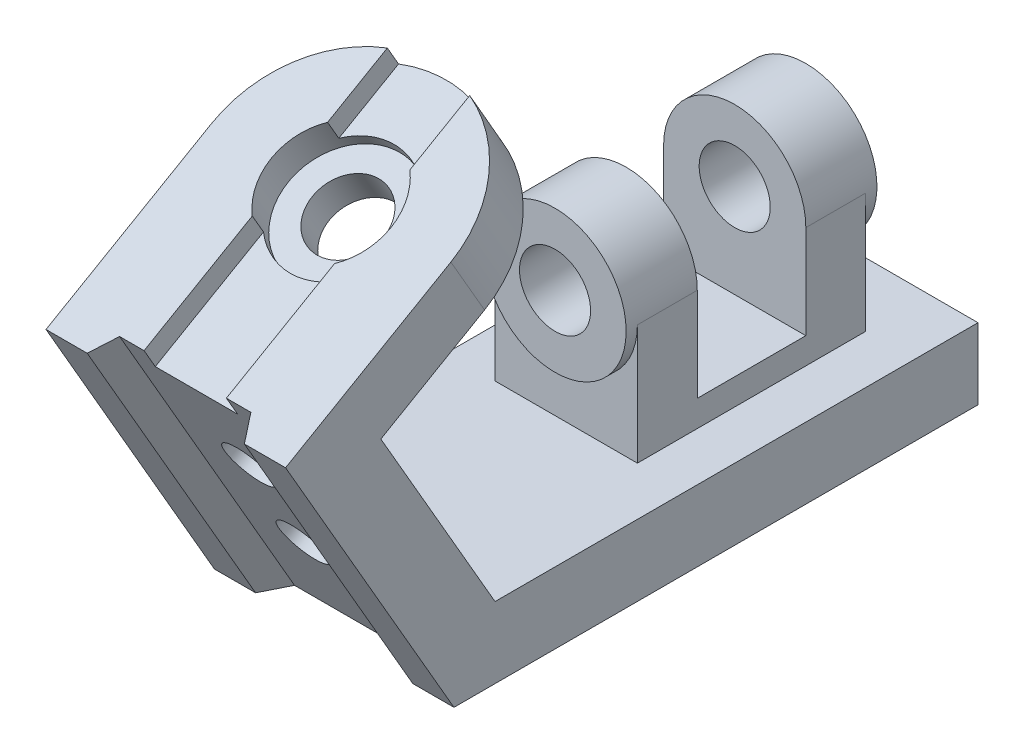
ISO-10303-21;
HEADER;
FILE_DESCRIPTION(('STEP AP214'),'2;1');
FILE_NAME('part.step','',(''),(''),'','','');
FILE_SCHEMA(('AUTOMOTIVE_DESIGN { 1 0 10303 214 1 1 1 1 }'));
ENDSEC;
DATA;
#1=APPLICATION_CONTEXT('core data for automotive mechanical design processes');
#2=APPLICATION_PROTOCOL_DEFINITION('international standard','automotive_design',2000,#1);
#3=PRODUCT_CONTEXT('',#1,'mechanical');
#4=PRODUCT('Part','Part','',(#3));
#5=PRODUCT_RELATED_PRODUCT_CATEGORY('part','',(#4));
#6=PRODUCT_DEFINITION_FORMATION('','',#4);
#7=PRODUCT_DEFINITION_CONTEXT('part definition',#1,'design');
#8=PRODUCT_DEFINITION('design','',#6,#7);
#9=PRODUCT_DEFINITION_SHAPE('','',#8);
#10=(LENGTH_UNIT() NAMED_UNIT(*) SI_UNIT(.MILLI.,.METRE.));
#11=(NAMED_UNIT(*) PLANE_ANGLE_UNIT() SI_UNIT($,.RADIAN.));
#12=(NAMED_UNIT(*) SI_UNIT($,.STERADIAN.) SOLID_ANGLE_UNIT());
#13=UNCERTAINTY_MEASURE_WITH_UNIT(LENGTH_MEASURE(1.E-05),#10,'distance_accuracy_value','');
#14=(GEOMETRIC_REPRESENTATION_CONTEXT(3) GLOBAL_UNCERTAINTY_ASSIGNED_CONTEXT((#13)) GLOBAL_UNIT_ASSIGNED_CONTEXT((#10,
#11,#12)) REPRESENTATION_CONTEXT('',''));
#15=CARTESIAN_POINT('',(0.,0.,0.));
#16=DIRECTION('',(0.,0.,1.));
#17=DIRECTION('',(1.,0.,0.));
#18=AXIS2_PLACEMENT_3D('',#15,#16,#17);
#19=CARTESIAN_POINT('',(0.,51.,-126.));
#20=DIRECTION('',(0.,0.,1.));
#21=DIRECTION('',(0.,-1.,0.));
#22=AXIS2_PLACEMENT_3D('',#19,#20,#21);
#23=CYLINDRICAL_SURFACE('',#22,19.);
#24=CARTESIAN_POINT('',(0.,51.,-59.));
#25=DIRECTION('',(0.,0.,-1.));
#26=DIRECTION('',(0.,1.,0.));
#27=AXIS2_PLACEMENT_3D('',#24,#25,#26);
#28=CIRCLE('',#27,19.);
#29=CARTESIAN_POINT('',(0.,70.,-59.));
#30=VERTEX_POINT('',#29);
#31=EDGE_CURVE('E268',#30,#30,#28,.T.);
#32=ORIENTED_EDGE('',*,*,#31,.T.);
#33=EDGE_LOOP('',(#32));
#34=FACE_BOUND('',#33,.T.);
#35=DIRECTION('',(0.,0.,-1.));
#36=VECTOR('',#35,1.);
#37=CARTESIAN_POINT('',(19.,51.,-62.));
#38=LINE('',#37,#36);
#39=CARTESIAN_POINT('',(19.,51.,-62.));
#40=VERTEX_POINT('',#39);
#41=CARTESIAN_POINT('',(19.,51.,-78.));
#42=VERTEX_POINT('',#41);
#43=EDGE_CURVE('E282',#40,#42,#38,.T.);
#44=ORIENTED_EDGE('',*,*,#43,.T.);
#45=CARTESIAN_POINT('',(0.,51.,-78.));
#46=DIRECTION('',(0.,0.,1.));
#47=DIRECTION('',(0.,-1.,0.));
#48=AXIS2_PLACEMENT_3D('',#45,#46,#47);
#49=CIRCLE('',#48,19.);
#50=CARTESIAN_POINT('',(-19.,51.,-78.));
#51=VERTEX_POINT('',#50);
#52=EDGE_CURVE('E251',#42,#51,#49,.T.);
#53=ORIENTED_EDGE('',*,*,#52,.T.);
#54=DIRECTION('',(0.,0.,1.));
#55=VECTOR('',#54,1.);
#56=CARTESIAN_POINT('',(-19.,51.,-62.));
#57=LINE('',#56,#55);
#58=CARTESIAN_POINT('',(-19.,51.,-62.));
#59=VERTEX_POINT('',#58);
#60=EDGE_CURVE('E250',#51,#59,#57,.T.);
#61=ORIENTED_EDGE('',*,*,#60,.T.);
#62=CARTESIAN_POINT('',(0.,51.,-62.));
#63=DIRECTION('',(0.,0.,-1.));
#64=DIRECTION('',(0.,1.,0.));
#65=AXIS2_PLACEMENT_3D('',#62,#63,#64);
#66=CIRCLE('',#65,19.);
#67=EDGE_CURVE('E275',#59,#40,#66,.F.);
#68=ORIENTED_EDGE('',*,*,#67,.T.);
#69=EDGE_LOOP('',(#44,#53,#61,#68));
#70=FACE_BOUND('',#69,.T.);
#71=ADVANCED_FACE('F45',(#34,#70),#23,.T.);
#72=CARTESIAN_POINT('',(0.,51.,-32.1299423149112));
#73=DIRECTION('',(0.,0.,-1.));
#74=DIRECTION('',(0.,1.,0.));
#75=AXIS2_PLACEMENT_3D('',#72,#73,#74);
#76=CYLINDRICAL_SURFACE('',#75,9.5);
#77=CARTESIAN_POINT('',(0.,51.,-78.));
#78=DIRECTION('',(0.,0.,1.));
#79=DIRECTION('',(0.,-1.,0.));
#80=AXIS2_PLACEMENT_3D('',#77,#78,#79);
#81=CIRCLE('',#80,9.5);
#82=CARTESIAN_POINT('',(0.,41.5,-78.));
#83=VERTEX_POINT('',#82);
#84=EDGE_CURVE('E260',#83,#83,#81,.F.);
#85=ORIENTED_EDGE('',*,*,#84,.T.);
#86=EDGE_LOOP('',(#85));
#87=FACE_BOUND('',#86,.T.);
#88=CARTESIAN_POINT('',(0.,51.,-59.));
#89=DIRECTION('',(0.,0.,-1.));
#90=DIRECTION('',(0.,1.,0.));
#91=AXIS2_PLACEMENT_3D('',#88,#89,#90);
#92=CIRCLE('',#91,9.5);
#93=CARTESIAN_POINT('',(0.,60.5,-59.));
#94=VERTEX_POINT('',#93);
#95=EDGE_CURVE('E264',#94,#94,#92,.F.);
#96=ORIENTED_EDGE('',*,*,#95,.T.);
#97=EDGE_LOOP('',(#96));
#98=FACE_BOUND('',#97,.T.);
#99=ADVANCED_FACE('F498',(#87,#98),#76,.F.);
#100=CARTESIAN_POINT('',(32.,19.,-140.));
#101=DIRECTION('',(0.,-1.,0.));
#102=DIRECTION('',(0.,0.,-1.));
#103=AXIS2_PLACEMENT_3D('',#100,#101,#102);
#104=PLANE('',#103);
#105=DIRECTION('',(0.,0.,1.));
#106=VECTOR('',#105,1.);
#107=CARTESIAN_POINT('',(-32.,19.,-140.));
#108=LINE('',#107,#106);
#109=CARTESIAN_POINT('',(-32.,19.,-140.));
#110=VERTEX_POINT('',#109);
#111=CARTESIAN_POINT('',(-32.,19.,-10.9696551146028));
#112=VERTEX_POINT('',#111);
#113=EDGE_CURVE('E420',#110,#112,#108,.T.);
#114=ORIENTED_EDGE('',*,*,#113,.T.);
#115=DIRECTION('',(-1.,0.,0.));
#116=VECTOR('',#115,1.);
#117=CARTESIAN_POINT('',(32.,19.,-10.9696551146028));
#118=LINE('',#117,#116);
#119=CARTESIAN_POINT('',(32.,19.,-10.9696551146028));
#120=VERTEX_POINT('',#119);
#121=EDGE_CURVE('E436',#120,#112,#118,.T.);
#122=ORIENTED_EDGE('',*,*,#121,.F.);
#123=DIRECTION('',(0.,0.,1.));
#124=VECTOR('',#123,1.);
#125=CARTESIAN_POINT('',(32.,19.,-140.));
#126=LINE('',#125,#124);
#127=CARTESIAN_POINT('',(32.,19.,-140.));
#128=VERTEX_POINT('',#127);
#129=EDGE_CURVE('E405',#128,#120,#126,.T.);
#130=ORIENTED_EDGE('',*,*,#129,.F.);
#131=DIRECTION('',(-1.,0.,0.));
#132=VECTOR('',#131,1.);
#133=CARTESIAN_POINT('',(32.,19.,-140.));
#134=LINE('',#133,#132);
#135=EDGE_CURVE('E438',#128,#110,#134,.T.);
#136=ORIENTED_EDGE('',*,*,#135,.T.);
#137=EDGE_LOOP('',(#114,#122,#130,#136));
#138=FACE_BOUND('',#137,.T.);
#139=DIRECTION('',(0.,0.,-1.));
#140=VECTOR('',#139,1.);
#141=CARTESIAN_POINT('',(19.,19.,-62.));
#142=LINE('',#141,#140);
#143=CARTESIAN_POINT('',(19.,19.,-62.));
#144=VERTEX_POINT('',#143);
#145=CARTESIAN_POINT('',(19.,19.,-123.));
#146=VERTEX_POINT('',#145);
#147=EDGE_CURVE('E278',#144,#146,#142,.T.);
#148=ORIENTED_EDGE('',*,*,#147,.F.);
#149=DIRECTION('',(1.,0.,0.));
#150=VECTOR('',#149,1.);
#151=CARTESIAN_POINT('',(-19.,19.,-62.));
#152=LINE('',#151,#150);
#153=CARTESIAN_POINT('',(-19.,19.,-62.));
#154=VERTEX_POINT('',#153);
#155=EDGE_CURVE('E294',#154,#144,#152,.T.);
#156=ORIENTED_EDGE('',*,*,#155,.F.);
#157=DIRECTION('',(0.,0.,1.));
#158=VECTOR('',#157,1.);
#159=CARTESIAN_POINT('',(-19.,19.,-62.));
#160=LINE('',#159,#158);
#161=CARTESIAN_POINT('',(-19.,19.,-123.));
#162=VERTEX_POINT('',#161);
#163=EDGE_CURVE('E292',#162,#154,#160,.T.);
#164=ORIENTED_EDGE('',*,*,#163,.F.);
#165=DIRECTION('',(-1.,0.,0.));
#166=VECTOR('',#165,1.);
#167=CARTESIAN_POINT('',(-19.,19.,-123.));
#168=LINE('',#167,#166);
#169=EDGE_CURVE('E63',#146,#162,#168,.T.);
#170=ORIENTED_EDGE('',*,*,#169,.F.);
#171=EDGE_LOOP('',(#148,#156,#164,#170));
#172=FACE_BOUND('',#171,.T.);
#173=ADVANCED_FACE('F480',(#138,#172),#104,.F.);
#174=CARTESIAN_POINT('',(32.,77.9422863405993,45.0000000000004));
#175=DIRECTION('',(0.,-0.866025403784436,-0.500000000000005));
#176=DIRECTION('',(0.,0.500000000000005,-0.866025403784436));
#177=AXIS2_PLACEMENT_3D('',#174,#175,#176);
#178=PLANE('',#177);
#179=DIRECTION('',(0.,0.500000000000005,-0.866025403784436));
#180=VECTOR('',#179,1.);
#181=CARTESIAN_POINT('',(11.,73.6922863405992,52.361215932168));
#182=LINE('',#181,#180);
#183=CARTESIAN_POINT('',(11.,80.9422863405993,39.8038475772938));
#184=VERTEX_POINT('',#183);
#185=CARTESIAN_POINT('',(11.,97.6328113212884,10.8950103057431));
#186=VERTEX_POINT('',#185);
#187=EDGE_CURVE('E328',#184,#186,#182,.T.);
#188=ORIENTED_EDGE('',*,*,#187,.F.);
#189=DIRECTION('',(1.,0.,0.));
#190=VECTOR('',#189,1.);
#191=CARTESIAN_POINT('',(-17.5358983848623,80.9422863405993,39.8038475772938));
#192=LINE('',#191,#190);
#193=CARTESIAN_POINT('',(17.5358983848623,80.9422863405993,39.8038475772938));
#194=VERTEX_POINT('',#193);
#195=EDGE_CURVE('E360',#184,#194,#192,.T.);
#196=ORIENTED_EDGE('',*,*,#195,.T.);
#197=DIRECTION('',(0.499999999999995,-0.433012701892225,0.75));
#198=VECTOR('',#197,1.);
#199=CARTESIAN_POINT('',(17.5358983848623,80.9422863405993,39.8038475772938));
#200=LINE('',#199,#198);
#201=CARTESIAN_POINT('',(21.,77.9422863405993,45.0000000000004));
#202=VERTEX_POINT('',#201);
#203=EDGE_CURVE('E358',#194,#202,#200,.T.);
#204=ORIENTED_EDGE('',*,*,#203,.T.);
#205=DIRECTION('',(-1.,0.,0.));
#206=VECTOR('',#205,1.);
#207=CARTESIAN_POINT('',(32.,77.9422863405993,45.0000000000004));
#208=LINE('',#207,#206);
#209=CARTESIAN_POINT('',(32.,77.9422863405993,45.0000000000004));
#210=VERTEX_POINT('',#209);
#211=EDGE_CURVE('E431',#210,#202,#208,.T.);
#212=ORIENTED_EDGE('',*,*,#211,.F.);
#213=DIRECTION('',(0.,-0.500000000000005,0.866025403784436));
#214=VECTOR('',#213,1.);
#215=CARTESIAN_POINT('',(32.,77.9422863405993,45.0000000000004));
#216=LINE('',#215,#214);
#217=CARTESIAN_POINT('',(32.,103.442286340599,0.832704406994142));
#218=VERTEX_POINT('',#217);
#219=EDGE_CURVE('E408',#218,#210,#216,.T.);
#220=ORIENTED_EDGE('',*,*,#219,.F.);
#221=CARTESIAN_POINT('',(0.,103.442286340599,0.832704406994136));
#222=DIRECTION('',(0.,0.866025403784436,0.500000000000005));
#223=DIRECTION('',(0.,-0.500000000000005,0.866025403784436));
#224=AXIS2_PLACEMENT_3D('',#221,#222,#223);
#225=CIRCLE('',#224,32.);
#226=CARTESIAN_POINT('',(11.,118.467265541916,-25.191322952352));
#227=VERTEX_POINT('',#226);
#228=EDGE_CURVE('E390',#218,#227,#225,.T.);
#229=ORIENTED_EDGE('',*,*,#228,.T.);
#230=CARTESIAN_POINT('',(11.,109.251761359911,-9.22960149175489));
#231=VERTEX_POINT('',#230);
#232=EDGE_CURVE('E312',#231,#227,#182,.T.);
#233=ORIENTED_EDGE('',*,*,#232,.F.);
#234=CARTESIAN_POINT('',(0.,103.442286340599,0.832704406994109));
#235=DIRECTION('',(0.,0.866025403784436,0.500000000000005));
#236=DIRECTION('',(0.,-0.500000000000005,0.866025403784436));
#237=AXIS2_PLACEMENT_3D('',#234,#235,#236);
#238=CIRCLE('',#237,16.);
#239=EDGE_CURVE('E382',#186,#231,#238,.T.);
#240=ORIENTED_EDGE('',*,*,#239,.F.);
#241=EDGE_LOOP('',(#188,#196,#204,#212,#220,#229,#233,#240));
#242=FACE_BOUND('',#241,.T.);
#243=ADVANCED_FACE('F606',(#242),#178,.F.);
#244=DIRECTION('',(0.,-0.500000000000005,0.866025403784436));
#245=VECTOR('',#244,1.);
#246=CARTESIAN_POINT('',(-11.,73.6922863405992,52.361215932168));
#247=LINE('',#246,#245);
#248=CARTESIAN_POINT('',(-11.,118.467265541916,-25.191322952352));
#249=VERTEX_POINT('',#248);
#250=CARTESIAN_POINT('',(-11.,109.251761359911,-9.2296014917549));
#251=VERTEX_POINT('',#250);
#252=EDGE_CURVE('E322',#249,#251,#247,.T.);
#253=ORIENTED_EDGE('',*,*,#252,.F.);
#254=CARTESIAN_POINT('',(-32.,103.442286340599,0.832704406994136));
#255=VERTEX_POINT('',#254);
#256=EDGE_CURVE('E385',#249,#255,#225,.T.);
#257=ORIENTED_EDGE('',*,*,#256,.T.);
#258=DIRECTION('',(0.,-0.500000000000005,0.866025403784436));
#259=VECTOR('',#258,1.);
#260=CARTESIAN_POINT('',(-32.,77.9422863405993,45.0000000000004));
#261=LINE('',#260,#259);
#262=CARTESIAN_POINT('',(-32.,77.9422863405993,45.0000000000004));
#263=VERTEX_POINT('',#262);
#264=EDGE_CURVE('E397',#255,#263,#261,.T.);
#265=ORIENTED_EDGE('',*,*,#264,.T.);
#266=CARTESIAN_POINT('',(-21.,77.9422863405993,45.0000000000004));
#267=VERTEX_POINT('',#266);
#268=EDGE_CURVE('E414',#267,#263,#208,.T.);
#269=ORIENTED_EDGE('',*,*,#268,.F.);
#270=DIRECTION('',(-0.499999999999995,-0.433012701892225,0.75));
#271=VECTOR('',#270,1.);
#272=CARTESIAN_POINT('',(-17.5358983848623,80.9422863405993,39.8038475772938));
#273=LINE('',#272,#271);
#274=CARTESIAN_POINT('',(-17.5358983848623,80.9422863405993,39.8038475772938));
#275=VERTEX_POINT('',#274);
#276=EDGE_CURVE('E351',#275,#267,#273,.T.);
#277=ORIENTED_EDGE('',*,*,#276,.F.);
#278=CARTESIAN_POINT('',(-11.,80.9422863405993,39.8038475772938));
#279=VERTEX_POINT('',#278);
#280=EDGE_CURVE('E356',#275,#279,#192,.T.);
#281=ORIENTED_EDGE('',*,*,#280,.T.);
#282=CARTESIAN_POINT('',(-11.,97.6328113212883,10.8950103057432));
#283=VERTEX_POINT('',#282);
#284=EDGE_CURVE('E329',#283,#279,#247,.T.);
#285=ORIENTED_EDGE('',*,*,#284,.F.);
#286=EDGE_CURVE('E387',#251,#283,#238,.T.);
#287=ORIENTED_EDGE('',*,*,#286,.F.);
#288=EDGE_LOOP('',(#253,#257,#265,#269,#277,#281,#285,#287));
#289=FACE_BOUND('',#288,.T.);
#290=ADVANCED_FACE('F730',(#289),#178,.F.);
#291=CARTESIAN_POINT('',(32.,0.,0.));
#292=DIRECTION('',(0.,0.500000000000004,-0.866025403784436));
#293=DIRECTION('',(0.,0.866025403784436,0.500000000000004));
#294=AXIS2_PLACEMENT_3D('',#291,#292,#293);
#295=PLANE('',#294);
#296=ORIENTED_EDGE('',*,*,#211,.T.);
#297=DIRECTION('',(0.,0.866025403784436,0.500000000000005));
#298=VECTOR('',#297,1.);
#299=CARTESIAN_POINT('',(21.,-60.6217782649111,-35.0000000000007));
#300=LINE('',#299,#298);
#301=CARTESIAN_POINT('',(21.,0.,0.));
#302=VERTEX_POINT('',#301);
#303=EDGE_CURVE('E367',#302,#202,#300,.T.);
#304=ORIENTED_EDGE('',*,*,#303,.F.);
#305=DIRECTION('',(-1.,0.,0.));
#306=VECTOR('',#305,1.);
#307=CARTESIAN_POINT('',(32.,0.,0.));
#308=LINE('',#307,#306);
#309=CARTESIAN_POINT('',(32.,0.,0.));
#310=VERTEX_POINT('',#309);
#311=EDGE_CURVE('E447',#310,#302,#308,.T.);
#312=ORIENTED_EDGE('',*,*,#311,.F.);
#313=DIRECTION('',(0.,-0.866025403784436,-0.500000000000004));
#314=VECTOR('',#313,1.);
#315=CARTESIAN_POINT('',(32.,0.,0.));
#316=LINE('',#315,#314);
#317=EDGE_CURVE('E391',#210,#310,#316,.T.);
#318=ORIENTED_EDGE('',*,*,#317,.F.);
#319=EDGE_LOOP('',(#296,#304,#312,#318));
#320=FACE_BOUND('',#319,.T.);
#321=ADVANCED_FACE('F731',(#320),#295,.F.);
#322=CARTESIAN_POINT('',(-21.,0.,0.));
#323=VERTEX_POINT('',#322);
#324=CARTESIAN_POINT('',(-32.,0.,0.));
#325=VERTEX_POINT('',#324);
#326=EDGE_CURVE('E443',#323,#325,#308,.T.);
#327=ORIENTED_EDGE('',*,*,#326,.F.);
#328=DIRECTION('',(0.,0.866025403784436,0.500000000000005));
#329=VECTOR('',#328,1.);
#330=CARTESIAN_POINT('',(-21.,-60.6217782649111,-35.0000000000007));
#331=LINE('',#330,#329);
#332=EDGE_CURVE('E361',#323,#267,#331,.T.);
#333=ORIENTED_EDGE('',*,*,#332,.T.);
#334=ORIENTED_EDGE('',*,*,#268,.T.);
#335=DIRECTION('',(0.,-0.866025403784436,-0.500000000000004));
#336=VECTOR('',#335,1.);
#337=CARTESIAN_POINT('',(-32.,0.,0.));
#338=LINE('',#337,#336);
#339=EDGE_CURVE('E395',#263,#325,#338,.T.);
#340=ORIENTED_EDGE('',*,*,#339,.T.);
#341=EDGE_LOOP('',(#327,#333,#334,#340));
#342=FACE_BOUND('',#341,.T.);
#343=ADVANCED_FACE('F42',(#342),#295,.F.);
#344=CARTESIAN_POINT('',(32.,0.,0.));
#345=DIRECTION('',(0.,1.,0.));
#346=DIRECTION('',(0.,0.,1.));
#347=AXIS2_PLACEMENT_3D('',#344,#345,#346);
#348=PLANE('',#347);
#349=DIRECTION('',(1.,0.,0.));
#350=VECTOR('',#349,1.);
#351=CARTESIAN_POINT('',(32.,0.,-6.92820323027557));
#352=LINE('',#351,#350);
#353=CARTESIAN_POINT('',(-17.5358983848623,0.,-6.92820323027558));
#354=VERTEX_POINT('',#353);
#355=CARTESIAN_POINT('',(17.5358983848623,0.,-6.92820323027558));
#356=VERTEX_POINT('',#355);
#357=EDGE_CURVE('E368',#354,#356,#352,.T.);
#358=ORIENTED_EDGE('',*,*,#357,.F.);
#359=DIRECTION('',(-0.447213595499952,0.,0.894427190999919));
#360=VECTOR('',#359,1.);
#361=CARTESIAN_POINT('',(-10.4000000000003,0.,-21.1999999999998));
#362=LINE('',#361,#360);
#363=EDGE_CURVE('E452',#354,#323,#362,.T.);
#364=ORIENTED_EDGE('',*,*,#363,.T.);
#365=ORIENTED_EDGE('',*,*,#326,.T.);
#366=DIRECTION('',(0.,0.,-1.));
#367=VECTOR('',#366,1.);
#368=CARTESIAN_POINT('',(-32.,0.,0.));
#369=LINE('',#368,#367);
#370=CARTESIAN_POINT('',(-32.,0.,-140.));
#371=VERTEX_POINT('',#370);
#372=EDGE_CURVE('E411',#325,#371,#369,.T.);
#373=ORIENTED_EDGE('',*,*,#372,.T.);
#374=DIRECTION('',(-1.,0.,0.));
#375=VECTOR('',#374,1.);
#376=CARTESIAN_POINT('',(32.,0.,-140.));
#377=LINE('',#376,#375);
#378=CARTESIAN_POINT('',(32.,0.,-140.));
#379=VERTEX_POINT('',#378);
#380=EDGE_CURVE('E445',#379,#371,#377,.T.);
#381=ORIENTED_EDGE('',*,*,#380,.F.);
#382=DIRECTION('',(0.,0.,-1.));
#383=VECTOR('',#382,1.);
#384=CARTESIAN_POINT('',(32.,0.,0.));
#385=LINE('',#384,#383);
#386=EDGE_CURVE('E399',#310,#379,#385,.T.);
#387=ORIENTED_EDGE('',*,*,#386,.F.);
#388=ORIENTED_EDGE('',*,*,#311,.T.);
#389=DIRECTION('',(0.447213595499952,0.,0.894427190999919));
#390=VECTOR('',#389,1.);
#391=CARTESIAN_POINT('',(23.2,0.,4.39999999999995));
#392=LINE('',#391,#390);
#393=EDGE_CURVE('E446',#356,#302,#392,.T.);
#394=ORIENTED_EDGE('',*,*,#393,.F.);
#395=EDGE_LOOP('',(#358,#364,#365,#373,#381,#387,#388,#394));
#396=FACE_BOUND('',#395,.T.);
#397=ADVANCED_FACE('F763',(#396),#348,.F.);
#398=CARTESIAN_POINT('',(32.,0.,-140.));
#399=DIRECTION('',(0.,0.,1.));
#400=DIRECTION('',(1.,0.,0.));
#401=AXIS2_PLACEMENT_3D('',#398,#399,#400);
#402=PLANE('',#401);
#403=DIRECTION('',(0.,1.,0.));
#404=VECTOR('',#403,1.);
#405=CARTESIAN_POINT('',(-32.,0.,-140.));
#406=LINE('',#405,#404);
#407=EDGE_CURVE('E417',#371,#110,#406,.T.);
#408=ORIENTED_EDGE('',*,*,#407,.T.);
#409=ORIENTED_EDGE('',*,*,#135,.F.);
#410=DIRECTION('',(0.,1.,0.));
#411=VECTOR('',#410,1.);
#412=CARTESIAN_POINT('',(32.,0.,-140.));
#413=LINE('',#412,#411);
#414=EDGE_CURVE('E396',#379,#128,#413,.T.);
#415=ORIENTED_EDGE('',*,*,#414,.F.);
#416=ORIENTED_EDGE('',*,*,#380,.T.);
#417=EDGE_LOOP('',(#408,#409,#415,#416));
#418=FACE_BOUND('',#417,.T.);
#419=ADVANCED_FACE('F649',(#418),#402,.F.);
#420=CARTESIAN_POINT('',(32.,19.,-10.9696551146028));
#421=DIRECTION('',(0.,-0.500000000000004,0.866025403784436));
#422=DIRECTION('',(0.,-0.866025403784436,-0.500000000000004));
#423=AXIS2_PLACEMENT_3D('',#420,#421,#422);
#424=PLANE('',#423);
#425=CARTESIAN_POINT('',(0.,57.9974226119286,11.545517328096));
#426=DIRECTION('',(0.,-0.500000000000004,0.866025403784436));
#427=DIRECTION('',(0.,-0.866025403784436,-0.500000000000004));
#428=AXIS2_PLACEMENT_3D('',#425,#426,#427);
#429=CIRCLE('',#428,6.5);
#430=CARTESIAN_POINT('',(0.,52.3682574873297,8.29551732809595));
#431=VERTEX_POINT('',#430);
#432=EDGE_CURVE('E313',#431,#431,#429,.F.);
#433=ORIENTED_EDGE('',*,*,#432,.F.);
#434=EDGE_LOOP('',(#433));
#435=FACE_BOUND('',#434,.T.);
#436=CARTESIAN_POINT('',(0.,32.8826859021799,-2.95448267190415));
#437=DIRECTION('',(0.,-0.500000000000004,0.866025403784436));
#438=DIRECTION('',(0.,-0.866025403784436,-0.500000000000004));
#439=AXIS2_PLACEMENT_3D('',#436,#437,#438);
#440=CIRCLE('',#439,6.5);
#441=CARTESIAN_POINT('',(0.,27.2535207775811,-6.20448267190418));
#442=VERTEX_POINT('',#441);
#443=EDGE_CURVE('E307',#442,#442,#440,.F.);
#444=ORIENTED_EDGE('',*,*,#443,.F.);
#445=EDGE_LOOP('',(#444));
#446=FACE_BOUND('',#445,.T.);
#447=DIRECTION('',(0.,0.866025403784436,0.500000000000004));
#448=VECTOR('',#447,1.);
#449=CARTESIAN_POINT('',(-32.,19.,-10.9696551146028));
#450=LINE('',#449,#448);
#451=CARTESIAN_POINT('',(-32.,71.8538290724795,19.545517328096));
#452=VERTEX_POINT('',#451);
#453=EDGE_CURVE('E423',#112,#452,#450,.T.);
#454=ORIENTED_EDGE('',*,*,#453,.T.);
#455=DIRECTION('',(-1.,0.,0.));
#456=VECTOR('',#455,1.);
#457=CARTESIAN_POINT('',(32.,71.8538290724795,19.545517328096));
#458=LINE('',#457,#456);
#459=CARTESIAN_POINT('',(32.,71.8538290724795,19.545517328096));
#460=VERTEX_POINT('',#459);
#461=EDGE_CURVE('E432',#460,#452,#458,.T.);
#462=ORIENTED_EDGE('',*,*,#461,.F.);
#463=DIRECTION('',(0.,0.866025403784436,0.500000000000004));
#464=VECTOR('',#463,1.);
#465=CARTESIAN_POINT('',(32.,19.,-10.9696551146028));
#466=LINE('',#465,#464);
#467=EDGE_CURVE('E404',#120,#460,#466,.T.);
#468=ORIENTED_EDGE('',*,*,#467,.F.);
#469=ORIENTED_EDGE('',*,*,#121,.T.);
#470=EDGE_LOOP('',(#454,#462,#468,#469));
#471=FACE_BOUND('',#470,.T.);
#472=ADVANCED_FACE('F642',(#435,#446,#471),#424,.F.);
#473=CARTESIAN_POINT('',(32.,87.8538290724796,-8.16729559300594));
#474=DIRECTION('',(0.,0.866025403784436,0.500000000000005));
#475=DIRECTION('',(0.,-0.500000000000005,0.866025403784436));
#476=AXIS2_PLACEMENT_3D('',#473,#474,#475);
#477=PLANE('',#476);
#478=CARTESIAN_POINT('',(0.,87.8538290724797,-8.16729559300597));
#479=DIRECTION('',(0.,0.866025403784436,0.500000000000005));
#480=DIRECTION('',(0.,-0.500000000000005,0.866025403784436));
#481=AXIS2_PLACEMENT_3D('',#478,#479,#480);
#482=CIRCLE('',#481,9.5);
#483=CARTESIAN_POINT('',(0.,83.1038290724796,0.0599457429461738));
#484=VERTEX_POINT('',#483);
#485=EDGE_CURVE('E374',#484,#484,#482,.F.);
#486=ORIENTED_EDGE('',*,*,#485,.F.);
#487=EDGE_LOOP('',(#486));
#488=FACE_BOUND('',#487,.T.);
#489=DIRECTION('',(0.,0.500000000000005,-0.866025403784436));
#490=VECTOR('',#489,1.);
#491=CARTESIAN_POINT('',(-32.,87.8538290724796,-8.16729559300594));
#492=LINE('',#491,#490);
#493=CARTESIAN_POINT('',(-32.,87.8538290724796,-8.16729559300594));
#494=VERTEX_POINT('',#493);
#495=EDGE_CURVE('E424',#452,#494,#492,.T.);
#496=ORIENTED_EDGE('',*,*,#495,.T.);
#497=CARTESIAN_POINT('',(0.,87.8538290724797,-8.16729559300595));
#498=DIRECTION('',(0.,0.866025403784436,0.500000000000005));
#499=DIRECTION('',(0.,-0.500000000000005,0.866025403784436));
#500=AXIS2_PLACEMENT_3D('',#497,#498,#499);
#501=CIRCLE('',#500,32.);
#502=CARTESIAN_POINT('',(32.,87.8538290724796,-8.16729559300594));
#503=VERTEX_POINT('',#502);
#504=EDGE_CURVE('E388',#494,#503,#501,.F.);
#505=ORIENTED_EDGE('',*,*,#504,.T.);
#506=DIRECTION('',(0.,0.500000000000005,-0.866025403784436));
#507=VECTOR('',#506,1.);
#508=CARTESIAN_POINT('',(32.,87.8538290724796,-8.16729559300594));
#509=LINE('',#508,#507);
#510=EDGE_CURVE('E407',#460,#503,#509,.T.);
#511=ORIENTED_EDGE('',*,*,#510,.F.);
#512=ORIENTED_EDGE('',*,*,#461,.T.);
#513=EDGE_LOOP('',(#496,#505,#511,#512));
#514=FACE_BOUND('',#513,.T.);
#515=ADVANCED_FACE('F647',(#488,#514),#477,.F.);
#516=CARTESIAN_POINT('',(32.,0.,0.));
#517=DIRECTION('',(-1.,0.,0.));
#518=DIRECTION('',(0.,0.,1.));
#519=AXIS2_PLACEMENT_3D('',#516,#517,#518);
#520=PLANE('',#519);
#521=ORIENTED_EDGE('',*,*,#317,.T.);
#522=ORIENTED_EDGE('',*,*,#386,.T.);
#523=ORIENTED_EDGE('',*,*,#414,.T.);
#524=ORIENTED_EDGE('',*,*,#129,.T.);
#525=ORIENTED_EDGE('',*,*,#467,.T.);
#526=ORIENTED_EDGE('',*,*,#510,.T.);
#527=DIRECTION('',(0.,0.866025403784436,0.500000000000005));
#528=VECTOR('',#527,1.);
#529=CARTESIAN_POINT('',(32.,103.442286340599,0.832704406994142));
#530=LINE('',#529,#528);
#531=EDGE_CURVE('E410',#503,#218,#530,.T.);
#532=ORIENTED_EDGE('',*,*,#531,.T.);
#533=ORIENTED_EDGE('',*,*,#219,.T.);
#534=EDGE_LOOP('',(#521,#522,#523,#524,#525,#526,#532,#533));
#535=FACE_BOUND('',#534,.T.);
#536=ADVANCED_FACE('F796',(#535),#520,.F.);
#537=CARTESIAN_POINT('',(-32.,0.,0.));
#538=DIRECTION('',(-1.,0.,0.));
#539=DIRECTION('',(0.,0.,1.));
#540=AXIS2_PLACEMENT_3D('',#537,#538,#539);
#541=PLANE('',#540);
#542=ORIENTED_EDGE('',*,*,#339,.F.);
#543=ORIENTED_EDGE('',*,*,#264,.F.);
#544=DIRECTION('',(0.,0.866025403784436,0.500000000000005));
#545=VECTOR('',#544,1.);
#546=CARTESIAN_POINT('',(-32.,103.442286340599,0.832704406994142));
#547=LINE('',#546,#545);
#548=EDGE_CURVE('E426',#494,#255,#547,.T.);
#549=ORIENTED_EDGE('',*,*,#548,.F.);
#550=ORIENTED_EDGE('',*,*,#495,.F.);
#551=ORIENTED_EDGE('',*,*,#453,.F.);
#552=ORIENTED_EDGE('',*,*,#113,.F.);
#553=ORIENTED_EDGE('',*,*,#407,.F.);
#554=ORIENTED_EDGE('',*,*,#372,.F.);
#555=EDGE_LOOP('',(#542,#543,#549,#550,#551,#552,#553,#554));
#556=FACE_BOUND('',#555,.T.);
#557=ADVANCED_FACE('F724',(#556),#541,.T.);
#558=CARTESIAN_POINT('',(0.,9.47015730341819,-53.4221295889454));
#559=DIRECTION('',(0.,0.866025403784436,0.500000000000005));
#560=DIRECTION('',(0.,-0.500000000000005,0.866025403784436));
#561=AXIS2_PLACEMENT_3D('',#558,#559,#560);
#562=CYLINDRICAL_SURFACE('',#561,32.);
#563=DIRECTION('',(0.,0.866025403784436,0.500000000000005));
#564=VECTOR('',#563,1.);
#565=CARTESIAN_POINT('',(11.,24.495136504735,-79.4461569482915));
#566=LINE('',#565,#564);
#567=CARTESIAN_POINT('',(11.,113.27111311921,-28.191322952352));
#568=VERTEX_POINT('',#567);
#569=EDGE_CURVE('E354',#227,#568,#566,.F.);
#570=ORIENTED_EDGE('',*,*,#569,.F.);
#571=ORIENTED_EDGE('',*,*,#228,.F.);
#572=ORIENTED_EDGE('',*,*,#531,.F.);
#573=ORIENTED_EDGE('',*,*,#504,.F.);
#574=ORIENTED_EDGE('',*,*,#548,.T.);
#575=ORIENTED_EDGE('',*,*,#256,.F.);
#576=DIRECTION('',(0.,0.866025403784436,0.500000000000005));
#577=VECTOR('',#576,1.);
#578=CARTESIAN_POINT('',(-11.,24.495136504735,-79.4461569482915));
#579=LINE('',#578,#577);
#580=CARTESIAN_POINT('',(-11.,113.27111311921,-28.191322952352));
#581=VERTEX_POINT('',#580);
#582=EDGE_CURVE('E345',#581,#249,#579,.T.);
#583=ORIENTED_EDGE('',*,*,#582,.F.);
#584=CARTESIAN_POINT('',(0.,98.2461339178929,-2.16729559300589));
#585=DIRECTION('',(0.,-0.866025403784436,-0.500000000000005));
#586=DIRECTION('',(0.,0.500000000000005,-0.866025403784436));
#587=AXIS2_PLACEMENT_3D('',#584,#585,#586);
#588=CIRCLE('',#587,32.);
#589=EDGE_CURVE('E337',#568,#581,#588,.F.);
#590=ORIENTED_EDGE('',*,*,#589,.F.);
#591=EDGE_LOOP('',(#570,#571,#572,#573,#574,#575,#583,#590));
#592=FACE_BOUND('',#591,.T.);
#593=ADVANCED_FACE('F715',(#592),#562,.T.);
#594=CARTESIAN_POINT('',(0.,95.6480577065396,-3.66729559300593));
#595=DIRECTION('',(0.,0.866025403784436,0.500000000000005));
#596=DIRECTION('',(0.,-0.500000000000005,0.866025403784436));
#597=AXIS2_PLACEMENT_3D('',#594,#595,#596);
#598=CYLINDRICAL_SURFACE('',#597,16.);
#599=CARTESIAN_POINT('',(0.,98.2461339178929,-2.1672955930059));
#600=DIRECTION('',(0.,-0.866025403784436,-0.500000000000005));
#601=DIRECTION('',(0.,0.500000000000005,-0.866025403784436));
#602=AXIS2_PLACEMENT_3D('',#599,#600,#601);
#603=CIRCLE('',#602,16.);
#604=CARTESIAN_POINT('',(-11.,92.4366588985817,7.89501030574313));
#605=VERTEX_POINT('',#604);
#606=CARTESIAN_POINT('',(11.,92.4366588985817,7.89501030574312));
#607=VERTEX_POINT('',#606);
#608=EDGE_CURVE('E333',#605,#607,#603,.F.);
#609=ORIENTED_EDGE('',*,*,#608,.T.);
#610=DIRECTION('',(0.,0.866025403784436,0.500000000000005));
#611=VECTOR('',#610,1.);
#612=CARTESIAN_POINT('',(11.,89.8385826872284,6.39501030574309));
#613=LINE('',#612,#611);
#614=EDGE_CURVE('E347',#607,#186,#613,.T.);
#615=ORIENTED_EDGE('',*,*,#614,.T.);
#616=ORIENTED_EDGE('',*,*,#239,.T.);
#617=DIRECTION('',(0.,0.866025403784436,0.500000000000005));
#618=VECTOR('',#617,1.);
#619=CARTESIAN_POINT('',(11.,101.457532725851,-13.729601491755));
#620=LINE('',#619,#618);
#621=CARTESIAN_POINT('',(11.,104.055608937204,-12.2296014917549));
#622=VERTEX_POINT('',#621);
#623=EDGE_CURVE('E349',#231,#622,#620,.F.);
#624=ORIENTED_EDGE('',*,*,#623,.T.);
#625=CARTESIAN_POINT('',(-11.,104.055608937204,-12.2296014917549));
#626=VERTEX_POINT('',#625);
#627=EDGE_CURVE('E335',#622,#626,#603,.F.);
#628=ORIENTED_EDGE('',*,*,#627,.T.);
#629=DIRECTION('',(0.,0.866025403784436,0.500000000000005));
#630=VECTOR('',#629,1.);
#631=CARTESIAN_POINT('',(-11.,101.457532725851,-13.729601491755));
#632=LINE('',#631,#630);
#633=EDGE_CURVE('E340',#626,#251,#632,.T.);
#634=ORIENTED_EDGE('',*,*,#633,.T.);
#635=ORIENTED_EDGE('',*,*,#286,.T.);
#636=DIRECTION('',(0.,0.866025403784436,0.500000000000005));
#637=VECTOR('',#636,1.);
#638=CARTESIAN_POINT('',(-11.,89.8385826872284,6.39501030574309));
#639=LINE('',#638,#637);
#640=EDGE_CURVE('E343',#283,#605,#639,.F.);
#641=ORIENTED_EDGE('',*,*,#640,.T.);
#642=EDGE_LOOP('',(#609,#615,#616,#624,#628,#634,#635,#641));
#643=FACE_BOUND('',#642,.T.);
#644=CARTESIAN_POINT('',(0.,95.6480577065396,-3.66729559300593));
#645=DIRECTION('',(0.,0.866025403784436,0.500000000000005));
#646=DIRECTION('',(0.,-0.500000000000005,0.866025403784436));
#647=AXIS2_PLACEMENT_3D('',#644,#645,#646);
#648=CIRCLE('',#647,16.);
#649=CARTESIAN_POINT('',(0.,87.6480577065395,10.189110867545));
#650=VERTEX_POINT('',#649);
#651=EDGE_CURVE('E377',#650,#650,#648,.T.);
#652=ORIENTED_EDGE('',*,*,#651,.F.);
#653=EDGE_LOOP('',(#652));
#654=FACE_BOUND('',#653,.T.);
#655=ADVANCED_FACE('F710',(#643,#654),#598,.F.);
#656=CARTESIAN_POINT('',(0.,70.1480577065393,40.5000000000004));
#657=DIRECTION('',(0.,0.866025403784436,0.500000000000005));
#658=DIRECTION('',(0.,-0.500000000000005,0.866025403784436));
#659=AXIS2_PLACEMENT_3D('',#656,#657,#658);
#660=PLANE('',#659);
#661=CARTESIAN_POINT('',(0.,95.6480577065396,-3.66729559300593));
#662=DIRECTION('',(0.,0.866025403784436,0.500000000000005));
#663=DIRECTION('',(0.,-0.500000000000005,0.866025403784436));
#664=AXIS2_PLACEMENT_3D('',#661,#662,#663);
#665=CIRCLE('',#664,9.5);
#666=CARTESIAN_POINT('',(0.,90.8980577065395,4.55994574294621));
#667=VERTEX_POINT('',#666);
#668=EDGE_CURVE('E378',#667,#667,#665,.T.);
#669=ORIENTED_EDGE('',*,*,#668,.F.);
#670=EDGE_LOOP('',(#669));
#671=FACE_BOUND('',#670,.T.);
#672=ORIENTED_EDGE('',*,*,#651,.T.);
#673=EDGE_LOOP('',(#672));
#674=FACE_BOUND('',#673,.T.);
#675=ADVANCED_FACE('F711',(#671,#674),#660,.T.);
#676=CARTESIAN_POINT('',(0.,64.5836765160395,-21.6023244355505));
#677=DIRECTION('',(0.,0.866025403784436,0.500000000000005));
#678=DIRECTION('',(0.,-0.500000000000005,0.866025403784436));
#679=AXIS2_PLACEMENT_3D('',#676,#677,#678);
#680=CYLINDRICAL_SURFACE('',#679,9.5);
#681=ORIENTED_EDGE('',*,*,#668,.T.);
#682=EDGE_LOOP('',(#681));
#683=FACE_BOUND('',#682,.T.);
#684=ORIENTED_EDGE('',*,*,#485,.T.);
#685=EDGE_LOOP('',(#684));
#686=FACE_BOUND('',#685,.T.);
#687=ADVANCED_FACE('F756',(#683,#686),#680,.F.);
#688=CARTESIAN_POINT('',(-17.5358983848623,-57.6217782649111,-40.1961524227073));
#689=DIRECTION('',(-0.866025403784441,0.25,-0.433012701892214));
#690=DIRECTION('',(-0.447213595499952,0.,0.894427190999919));
#691=AXIS2_PLACEMENT_3D('',#688,#689,#690);
#692=PLANE('',#691);
#693=DIRECTION('',(0.,0.866025403784436,0.500000000000005));
#694=VECTOR('',#693,1.);
#695=CARTESIAN_POINT('',(-17.5358983848623,-57.6217782649111,-40.1961524227073));
#696=LINE('',#695,#694);
#697=EDGE_CURVE('E365',#354,#275,#696,.T.);
#698=ORIENTED_EDGE('',*,*,#697,.T.);
#699=ORIENTED_EDGE('',*,*,#276,.T.);
#700=ORIENTED_EDGE('',*,*,#332,.F.);
#701=ORIENTED_EDGE('',*,*,#363,.F.);
#702=EDGE_LOOP('',(#698,#699,#700,#701));
#703=FACE_BOUND('',#702,.T.);
#704=ADVANCED_FACE('F747',(#703),#692,.F.);
#705=CARTESIAN_POINT('',(17.5358983848623,-57.6217782649111,-40.1961524227073));
#706=DIRECTION('',(-0.866025403784441,-0.25,0.433012701892214));
#707=DIRECTION('',(0.447213595499952,0.,0.894427190999919));
#708=AXIS2_PLACEMENT_3D('',#705,#706,#707);
#709=PLANE('',#708);
#710=ORIENTED_EDGE('',*,*,#393,.T.);
#711=ORIENTED_EDGE('',*,*,#303,.T.);
#712=ORIENTED_EDGE('',*,*,#203,.F.);
#713=DIRECTION('',(0.,0.866025403784436,0.500000000000005));
#714=VECTOR('',#713,1.);
#715=CARTESIAN_POINT('',(17.5358983848623,-57.6217782649111,-40.1961524227073));
#716=LINE('',#715,#714);
#717=EDGE_CURVE('E370',#356,#194,#716,.T.);
#718=ORIENTED_EDGE('',*,*,#717,.F.);
#719=EDGE_LOOP('',(#710,#711,#712,#718));
#720=FACE_BOUND('',#719,.T.);
#721=ADVANCED_FACE('F637',(#720),#709,.T.);
#722=CARTESIAN_POINT('',(-17.5358983848623,-57.6217782649111,-40.1961524227073));
#723=DIRECTION('',(0.,-0.500000000000005,0.866025403784436));
#724=DIRECTION('',(0.,-0.866025403784436,-0.500000000000005));
#725=AXIS2_PLACEMENT_3D('',#722,#723,#724);
#726=PLANE('',#725);
#727=CARTESIAN_POINT('',(0.,51.4974226119285,22.8038475772936));
#728=DIRECTION('',(0.,-0.500000000000005,0.866025403784436));
#729=DIRECTION('',(0.,-0.866025403784436,-0.500000000000005));
#730=AXIS2_PLACEMENT_3D('',#727,#728,#729);
#731=CIRCLE('',#730,6.5);
#732=CARTESIAN_POINT('',(0.,45.8682574873297,19.5538475772936));
#733=VERTEX_POINT('',#732);
#734=EDGE_CURVE('E306',#733,#733,#731,.T.);
#735=ORIENTED_EDGE('',*,*,#734,.F.);
#736=EDGE_LOOP('',(#735));
#737=FACE_BOUND('',#736,.T.);
#738=CARTESIAN_POINT('',(0.,26.3826859021799,8.3038475772935));
#739=DIRECTION('',(0.,-0.500000000000005,0.866025403784436));
#740=DIRECTION('',(0.,-0.866025403784436,-0.500000000000005));
#741=AXIS2_PLACEMENT_3D('',#738,#739,#740);
#742=CIRCLE('',#741,6.5);
#743=CARTESIAN_POINT('',(0.,20.753520777581,5.05384757729347));
#744=VERTEX_POINT('',#743);
#745=EDGE_CURVE('E315',#744,#744,#742,.T.);
#746=ORIENTED_EDGE('',*,*,#745,.F.);
#747=EDGE_LOOP('',(#746));
#748=FACE_BOUND('',#747,.T.);
#749=DIRECTION('',(0.,0.866025403784436,0.500000000000005));
#750=VECTOR('',#749,1.);
#751=CARTESIAN_POINT('',(11.,-57.6217782649111,-40.1961524227073));
#752=LINE('',#751,#750);
#753=CARTESIAN_POINT('',(11.,75.7461339178927,36.8038475772938));
#754=VERTEX_POINT('',#753);
#755=EDGE_CURVE('E49',#754,#184,#752,.T.);
#756=ORIENTED_EDGE('',*,*,#755,.F.);
#757=DIRECTION('',(1.,0.,0.));
#758=VECTOR('',#757,1.);
#759=CARTESIAN_POINT('',(-17.5358983848623,75.7461339178927,36.8038475772938));
#760=LINE('',#759,#758);
#761=CARTESIAN_POINT('',(-11.,75.7461339178927,36.8038475772938));
#762=VERTEX_POINT('',#761);
#763=EDGE_CURVE('E457',#762,#754,#760,.T.);
#764=ORIENTED_EDGE('',*,*,#763,.F.);
#765=DIRECTION('',(0.,-0.866025403784436,-0.500000000000005));
#766=VECTOR('',#765,1.);
#767=CARTESIAN_POINT('',(-11.,-57.6217782649111,-40.1961524227073));
#768=LINE('',#767,#766);
#769=EDGE_CURVE('E456',#279,#762,#768,.T.);
#770=ORIENTED_EDGE('',*,*,#769,.F.);
#771=ORIENTED_EDGE('',*,*,#280,.F.);
#772=ORIENTED_EDGE('',*,*,#697,.F.);
#773=ORIENTED_EDGE('',*,*,#357,.T.);
#774=ORIENTED_EDGE('',*,*,#717,.T.);
#775=ORIENTED_EDGE('',*,*,#195,.F.);
#776=EDGE_LOOP('',(#756,#764,#770,#771,#772,#773,#774,#775));
#777=FACE_BOUND('',#776,.T.);
#778=ADVANCED_FACE('F634',(#737,#748,#777),#726,.T.);
#779=CARTESIAN_POINT('',(0.,72.7461339178926,42.0000000000004));
#780=DIRECTION('',(0.,-0.866025403784436,-0.500000000000005));
#781=DIRECTION('',(0.,0.500000000000005,-0.866025403784436));
#782=AXIS2_PLACEMENT_3D('',#779,#780,#781);
#783=PLANE('',#782);
#784=DIRECTION('',(0.,-0.500000000000005,0.866025403784436));
#785=VECTOR('',#784,1.);
#786=CARTESIAN_POINT('',(-11.,68.4961339178926,49.361215932168));
#787=LINE('',#786,#785);
#788=EDGE_CURVE('E324',#605,#762,#787,.T.);
#789=ORIENTED_EDGE('',*,*,#788,.T.);
#790=ORIENTED_EDGE('',*,*,#763,.T.);
#791=DIRECTION('',(0.,0.500000000000005,-0.866025403784436));
#792=VECTOR('',#791,1.);
#793=CARTESIAN_POINT('',(11.,68.4961339178926,49.361215932168));
#794=LINE('',#793,#792);
#795=EDGE_CURVE('E323',#754,#607,#794,.T.);
#796=ORIENTED_EDGE('',*,*,#795,.T.);
#797=ORIENTED_EDGE('',*,*,#608,.F.);
#798=EDGE_LOOP('',(#789,#790,#796,#797));
#799=FACE_BOUND('',#798,.T.);
#800=ADVANCED_FACE('F638',(#799),#783,.F.);
#801=CARTESIAN_POINT('',(-11.,68.4961339178926,49.361215932168));
#802=DIRECTION('',(-1.,0.,0.));
#803=DIRECTION('',(0.,0.,1.));
#804=AXIS2_PLACEMENT_3D('',#801,#802,#803);
#805=PLANE('',#804);
#806=ORIENTED_EDGE('',*,*,#284,.T.);
#807=ORIENTED_EDGE('',*,*,#769,.T.);
#808=ORIENTED_EDGE('',*,*,#788,.F.);
#809=ORIENTED_EDGE('',*,*,#640,.F.);
#810=EDGE_LOOP('',(#806,#807,#808,#809));
#811=FACE_BOUND('',#810,.T.);
#812=ADVANCED_FACE('F674',(#811),#805,.F.);
#813=CARTESIAN_POINT('',(11.,68.4961339178926,49.361215932168));
#814=DIRECTION('',(1.,0.,0.));
#815=DIRECTION('',(0.,0.,-1.));
#816=AXIS2_PLACEMENT_3D('',#813,#814,#815);
#817=PLANE('',#816);
#818=ORIENTED_EDGE('',*,*,#795,.F.);
#819=ORIENTED_EDGE('',*,*,#755,.T.);
#820=ORIENTED_EDGE('',*,*,#187,.T.);
#821=ORIENTED_EDGE('',*,*,#614,.F.);
#822=EDGE_LOOP('',(#818,#819,#820,#821));
#823=FACE_BOUND('',#822,.T.);
#824=ADVANCED_FACE('F679',(#823),#817,.F.);
#825=ORIENTED_EDGE('',*,*,#569,.T.);
#826=EDGE_CURVE('E319',#622,#568,#794,.T.);
#827=ORIENTED_EDGE('',*,*,#826,.F.);
#828=ORIENTED_EDGE('',*,*,#623,.F.);
#829=ORIENTED_EDGE('',*,*,#232,.T.);
#830=EDGE_LOOP('',(#825,#827,#828,#829));
#831=FACE_BOUND('',#830,.T.);
#832=ADVANCED_FACE('F666',(#831),#817,.F.);
#833=ORIENTED_EDGE('',*,*,#582,.T.);
#834=ORIENTED_EDGE('',*,*,#252,.T.);
#835=ORIENTED_EDGE('',*,*,#633,.F.);
#836=EDGE_CURVE('E330',#581,#626,#787,.T.);
#837=ORIENTED_EDGE('',*,*,#836,.F.);
#838=EDGE_LOOP('',(#833,#834,#835,#837));
#839=FACE_BOUND('',#838,.T.);
#840=ADVANCED_FACE('F659',(#839),#805,.F.);
#841=ORIENTED_EDGE('',*,*,#589,.T.);
#842=ORIENTED_EDGE('',*,*,#836,.T.);
#843=ORIENTED_EDGE('',*,*,#627,.F.);
#844=ORIENTED_EDGE('',*,*,#826,.T.);
#845=EDGE_LOOP('',(#841,#842,#843,#844));
#846=FACE_BOUND('',#845,.T.);
#847=ADVANCED_FACE('F623',(#846),#783,.F.);
#848=CARTESIAN_POINT('',(0.,42.0750740576051,-18.8761659999948));
#849=DIRECTION('',(0.,-0.500000000000005,0.866025403784436));
#850=DIRECTION('',(0.,-0.866025403784436,-0.500000000000005));
#851=AXIS2_PLACEMENT_3D('',#848,#849,#850);
#852=CYLINDRICAL_SURFACE('',#851,6.5);
#853=ORIENTED_EDGE('',*,*,#443,.T.);
#854=EDGE_LOOP('',(#853));
#855=FACE_BOUND('',#854,.T.);
#856=ORIENTED_EDGE('',*,*,#745,.T.);
#857=EDGE_LOOP('',(#856));
#858=FACE_BOUND('',#857,.T.);
#859=ADVANCED_FACE('F619',(#855,#858),#852,.F.);
#860=CARTESIAN_POINT('',(0.,67.1898107673538,-4.37616599999463));
#861=DIRECTION('',(0.,-0.500000000000005,0.866025403784436));
#862=DIRECTION('',(0.,-0.866025403784436,-0.500000000000005));
#863=AXIS2_PLACEMENT_3D('',#860,#861,#862);
#864=CYLINDRICAL_SURFACE('',#863,6.5);
#865=ORIENTED_EDGE('',*,*,#432,.T.);
#866=EDGE_LOOP('',(#865));
#867=FACE_BOUND('',#866,.T.);
#868=ORIENTED_EDGE('',*,*,#734,.T.);
#869=EDGE_LOOP('',(#868));
#870=FACE_BOUND('',#869,.T.);
#871=ADVANCED_FACE('F569',(#867,#870),#864,.F.);
#872=CARTESIAN_POINT('',(19.,51.,-62.));
#873=DIRECTION('',(-1.,0.,0.));
#874=DIRECTION('',(0.,0.,1.));
#875=AXIS2_PLACEMENT_3D('',#872,#873,#874);
#876=PLANE('',#875);
#877=DIRECTION('',(0.,0.,1.));
#878=VECTOR('',#877,1.);
#879=CARTESIAN_POINT('',(19.,26.,-62.));
#880=LINE('',#879,#878);
#881=CARTESIAN_POINT('',(19.,26.,-107.));
#882=VERTEX_POINT('',#881);
#883=CARTESIAN_POINT('',(19.,26.,-78.));
#884=VERTEX_POINT('',#883);
#885=EDGE_CURVE('E238',#882,#884,#880,.T.);
#886=ORIENTED_EDGE('',*,*,#885,.T.);
#887=DIRECTION('',(0.,1.,0.));
#888=VECTOR('',#887,1.);
#889=CARTESIAN_POINT('',(19.,51.,-78.));
#890=LINE('',#889,#888);
#891=EDGE_CURVE('E252',#884,#42,#890,.T.);
#892=ORIENTED_EDGE('',*,*,#891,.T.);
#893=ORIENTED_EDGE('',*,*,#43,.F.);
#894=DIRECTION('',(0.,-1.,0.));
#895=VECTOR('',#894,1.);
#896=CARTESIAN_POINT('',(19.,51.,-62.));
#897=LINE('',#896,#895);
#898=EDGE_CURVE('E289',#40,#144,#897,.T.);
#899=ORIENTED_EDGE('',*,*,#898,.T.);
#900=ORIENTED_EDGE('',*,*,#147,.T.);
#901=DIRECTION('',(0.,-1.,0.));
#902=VECTOR('',#901,1.);
#903=CARTESIAN_POINT('',(19.,51.,-123.));
#904=LINE('',#903,#902);
#905=CARTESIAN_POINT('',(19.,51.,-123.));
#906=VERTEX_POINT('',#905);
#907=EDGE_CURVE('E301',#906,#146,#904,.T.);
#908=ORIENTED_EDGE('',*,*,#907,.F.);
#909=CARTESIAN_POINT('',(19.,51.,-107.));
#910=VERTEX_POINT('',#909);
#911=EDGE_CURVE('E281',#910,#906,#38,.T.);
#912=ORIENTED_EDGE('',*,*,#911,.F.);
#913=DIRECTION('',(0.,-1.,0.));
#914=VECTOR('',#913,1.);
#915=CARTESIAN_POINT('',(19.,51.,-107.));
#916=LINE('',#915,#914);
#917=EDGE_CURVE('E60',#910,#882,#916,.T.);
#918=ORIENTED_EDGE('',*,*,#917,.T.);
#919=EDGE_LOOP('',(#886,#892,#893,#899,#900,#908,#912,#918));
#920=FACE_BOUND('',#919,.T.);
#921=ADVANCED_FACE('F466',(#920),#876,.F.);
#922=CARTESIAN_POINT('',(-19.,51.,-123.));
#923=DIRECTION('',(0.,0.,1.));
#924=DIRECTION('',(0.,-1.,0.));
#925=AXIS2_PLACEMENT_3D('',#922,#923,#924);
#926=PLANE('',#925);
#927=CARTESIAN_POINT('',(0.,51.,-123.));
#928=DIRECTION('',(0.,0.,1.));
#929=DIRECTION('',(0.,-1.,0.));
#930=AXIS2_PLACEMENT_3D('',#927,#928,#929);
#931=CIRCLE('',#930,19.);
#932=CARTESIAN_POINT('',(-19.,51.,-123.));
#933=VERTEX_POINT('',#932);
#934=EDGE_CURVE('E280',#906,#933,#931,.F.);
#935=ORIENTED_EDGE('',*,*,#934,.F.);
#936=ORIENTED_EDGE('',*,*,#907,.T.);
#937=ORIENTED_EDGE('',*,*,#169,.T.);
#938=DIRECTION('',(0.,-1.,0.));
#939=VECTOR('',#938,1.);
#940=CARTESIAN_POINT('',(-19.,51.,-123.));
#941=LINE('',#940,#939);
#942=EDGE_CURVE('E304',#933,#162,#941,.T.);
#943=ORIENTED_EDGE('',*,*,#942,.F.);
#944=EDGE_LOOP('',(#935,#936,#937,#943));
#945=FACE_BOUND('',#944,.T.);
#946=ADVANCED_FACE('F477',(#945),#926,.F.);
#947=CARTESIAN_POINT('',(-19.,51.,-62.));
#948=DIRECTION('',(1.,0.,0.));
#949=DIRECTION('',(0.,0.,-1.));
#950=AXIS2_PLACEMENT_3D('',#947,#948,#949);
#951=PLANE('',#950);
#952=ORIENTED_EDGE('',*,*,#60,.F.);
#953=DIRECTION('',(0.,-1.,0.));
#954=VECTOR('',#953,1.);
#955=CARTESIAN_POINT('',(-19.,51.,-78.));
#956=LINE('',#955,#954);
#957=CARTESIAN_POINT('',(-19.,26.,-78.));
#958=VERTEX_POINT('',#957);
#959=EDGE_CURVE('E249',#51,#958,#956,.T.);
#960=ORIENTED_EDGE('',*,*,#959,.T.);
#961=DIRECTION('',(0.,0.,-1.));
#962=VECTOR('',#961,1.);
#963=CARTESIAN_POINT('',(-19.,26.,-62.));
#964=LINE('',#963,#962);
#965=CARTESIAN_POINT('',(-19.,26.,-107.));
#966=VERTEX_POINT('',#965);
#967=EDGE_CURVE('E11',#958,#966,#964,.T.);
#968=ORIENTED_EDGE('',*,*,#967,.T.);
#969=DIRECTION('',(0.,1.,0.));
#970=VECTOR('',#969,1.);
#971=CARTESIAN_POINT('',(-19.,51.,-107.));
#972=LINE('',#971,#970);
#973=CARTESIAN_POINT('',(-19.,51.,-107.));
#974=VERTEX_POINT('',#973);
#975=EDGE_CURVE('E227',#966,#974,#972,.T.);
#976=ORIENTED_EDGE('',*,*,#975,.T.);
#977=EDGE_CURVE('E283',#933,#974,#57,.T.);
#978=ORIENTED_EDGE('',*,*,#977,.F.);
#979=ORIENTED_EDGE('',*,*,#942,.T.);
#980=ORIENTED_EDGE('',*,*,#163,.T.);
#981=DIRECTION('',(0.,-1.,0.));
#982=VECTOR('',#981,1.);
#983=CARTESIAN_POINT('',(-19.,51.,-62.));
#984=LINE('',#983,#982);
#985=EDGE_CURVE('E296',#59,#154,#984,.T.);
#986=ORIENTED_EDGE('',*,*,#985,.F.);
#987=EDGE_LOOP('',(#952,#960,#968,#976,#978,#979,#980,#986));
#988=FACE_BOUND('',#987,.T.);
#989=ADVANCED_FACE('F248',(#988),#951,.F.);
#990=CARTESIAN_POINT('',(-19.,51.,-62.));
#991=DIRECTION('',(0.,0.,-1.));
#992=DIRECTION('',(0.,1.,0.));
#993=AXIS2_PLACEMENT_3D('',#990,#991,#992);
#994=PLANE('',#993);
#995=ORIENTED_EDGE('',*,*,#67,.F.);
#996=ORIENTED_EDGE('',*,*,#985,.T.);
#997=ORIENTED_EDGE('',*,*,#155,.T.);
#998=ORIENTED_EDGE('',*,*,#898,.F.);
#999=EDGE_LOOP('',(#995,#996,#997,#998));
#1000=FACE_BOUND('',#999,.T.);
#1001=ADVANCED_FACE('F474',(#1000),#994,.F.);
#1002=CARTESIAN_POINT('',(0.,51.,-126.));
#1003=DIRECTION('',(0.,0.,-1.));
#1004=DIRECTION('',(0.,1.,0.));
#1005=AXIS2_PLACEMENT_3D('',#1002,#1003,#1004);
#1006=CIRCLE('',#1005,19.);
#1007=CARTESIAN_POINT('',(0.,70.,-126.));
#1008=VERTEX_POINT('',#1007);
#1009=EDGE_CURVE('E267',#1008,#1008,#1006,.T.);
#1010=ORIENTED_EDGE('',*,*,#1009,.F.);
#1011=EDGE_LOOP('',(#1010));
#1012=FACE_BOUND('',#1011,.T.);
#1013=ORIENTED_EDGE('',*,*,#977,.T.);
#1014=CARTESIAN_POINT('',(0.,51.,-107.));
#1015=DIRECTION('',(0.,0.,-1.));
#1016=DIRECTION('',(0.,1.,0.));
#1017=AXIS2_PLACEMENT_3D('',#1014,#1015,#1016);
#1018=CIRCLE('',#1017,19.);
#1019=EDGE_CURVE('E228',#974,#910,#1018,.T.);
#1020=ORIENTED_EDGE('',*,*,#1019,.T.);
#1021=ORIENTED_EDGE('',*,*,#911,.T.);
#1022=ORIENTED_EDGE('',*,*,#934,.T.);
#1023=EDGE_LOOP('',(#1013,#1020,#1021,#1022));
#1024=FACE_BOUND('',#1023,.T.);
#1025=ADVANCED_FACE('F485',(#1012,#1024),#23,.T.);
#1026=CARTESIAN_POINT('',(0.,51.,-126.));
#1027=DIRECTION('',(0.,0.,-1.));
#1028=DIRECTION('',(0.,1.,0.));
#1029=AXIS2_PLACEMENT_3D('',#1026,#1027,#1028);
#1030=PLANE('',#1029);
#1031=CARTESIAN_POINT('',(0.,51.,-126.));
#1032=DIRECTION('',(0.,0.,-1.));
#1033=DIRECTION('',(0.,1.,0.));
#1034=AXIS2_PLACEMENT_3D('',#1031,#1032,#1033);
#1035=CIRCLE('',#1034,9.5);
#1036=CARTESIAN_POINT('',(0.,60.5,-126.));
#1037=VERTEX_POINT('',#1036);
#1038=EDGE_CURVE('E265',#1037,#1037,#1035,.T.);
#1039=ORIENTED_EDGE('',*,*,#1038,.F.);
#1040=EDGE_LOOP('',(#1039));
#1041=FACE_BOUND('',#1040,.T.);
#1042=ORIENTED_EDGE('',*,*,#1009,.T.);
#1043=EDGE_LOOP('',(#1042));
#1044=FACE_BOUND('',#1043,.T.);
#1045=ADVANCED_FACE('F482',(#1041,#1044),#1030,.T.);
#1046=CARTESIAN_POINT('',(0.,51.,-59.));
#1047=DIRECTION('',(0.,0.,-1.));
#1048=DIRECTION('',(0.,1.,0.));
#1049=AXIS2_PLACEMENT_3D('',#1046,#1047,#1048);
#1050=PLANE('',#1049);
#1051=ORIENTED_EDGE('',*,*,#95,.F.);
#1052=EDGE_LOOP('',(#1051));
#1053=FACE_BOUND('',#1052,.T.);
#1054=ORIENTED_EDGE('',*,*,#31,.F.);
#1055=EDGE_LOOP('',(#1054));
#1056=FACE_BOUND('',#1055,.T.);
#1057=ADVANCED_FACE('F495',(#1053,#1056),#1050,.F.);
#1058=CARTESIAN_POINT('',(0.,51.,-107.));
#1059=DIRECTION('',(0.,0.,-1.));
#1060=DIRECTION('',(0.,1.,0.));
#1061=AXIS2_PLACEMENT_3D('',#1058,#1059,#1060);
#1062=CIRCLE('',#1061,9.5);
#1063=CARTESIAN_POINT('',(0.,60.5,-107.));
#1064=VERTEX_POINT('',#1063);
#1065=EDGE_CURVE('E242',#1064,#1064,#1062,.F.);
#1066=ORIENTED_EDGE('',*,*,#1065,.T.);
#1067=EDGE_LOOP('',(#1066));
#1068=FACE_BOUND('',#1067,.T.);
#1069=ORIENTED_EDGE('',*,*,#1038,.T.);
#1070=EDGE_LOOP('',(#1069));
#1071=FACE_BOUND('',#1070,.T.);
#1072=ADVANCED_FACE('F509',(#1068,#1071),#76,.F.);
#1073=CARTESIAN_POINT('',(-33.5,26.,-78.));
#1074=DIRECTION('',(0.,-1.,0.));
#1075=DIRECTION('',(0.,0.,-1.));
#1076=AXIS2_PLACEMENT_3D('',#1073,#1074,#1075);
#1077=PLANE('',#1076);
#1078=DIRECTION('',(1.,0.,0.));
#1079=VECTOR('',#1078,1.);
#1080=CARTESIAN_POINT('',(-33.5,26.,-107.));
#1081=LINE('',#1080,#1079);
#1082=EDGE_CURVE('E226',#966,#882,#1081,.T.);
#1083=ORIENTED_EDGE('',*,*,#1082,.F.);
#1084=ORIENTED_EDGE('',*,*,#967,.F.);
#1085=DIRECTION('',(1.,0.,0.));
#1086=VECTOR('',#1085,1.);
#1087=CARTESIAN_POINT('',(-33.5,26.,-78.));
#1088=LINE('',#1087,#1086);
#1089=EDGE_CURVE('E244',#958,#884,#1088,.T.);
#1090=ORIENTED_EDGE('',*,*,#1089,.T.);
#1091=ORIENTED_EDGE('',*,*,#885,.F.);
#1092=EDGE_LOOP('',(#1083,#1084,#1090,#1091));
#1093=FACE_BOUND('',#1092,.T.);
#1094=ADVANCED_FACE('F237',(#1093),#1077,.F.);
#1095=CARTESIAN_POINT('',(-33.5,90.6077543559559,-78.));
#1096=DIRECTION('',(0.,0.,1.));
#1097=DIRECTION('',(0.,-1.,0.));
#1098=AXIS2_PLACEMENT_3D('',#1095,#1096,#1097);
#1099=PLANE('',#1098);
#1100=ORIENTED_EDGE('',*,*,#84,.F.);
#1101=EDGE_LOOP('',(#1100));
#1102=FACE_BOUND('',#1101,.T.);
#1103=ORIENTED_EDGE('',*,*,#1089,.F.);
#1104=ORIENTED_EDGE('',*,*,#959,.F.);
#1105=ORIENTED_EDGE('',*,*,#52,.F.);
#1106=ORIENTED_EDGE('',*,*,#891,.F.);
#1107=EDGE_LOOP('',(#1103,#1104,#1105,#1106));
#1108=FACE_BOUND('',#1107,.T.);
#1109=ADVANCED_FACE('F517',(#1102,#1108),#1099,.F.);
#1110=CARTESIAN_POINT('',(-33.5,90.6077543559559,-107.));
#1111=DIRECTION('',(0.,0.,-1.));
#1112=DIRECTION('',(0.,1.,0.));
#1113=AXIS2_PLACEMENT_3D('',#1110,#1111,#1112);
#1114=PLANE('',#1113);
#1115=ORIENTED_EDGE('',*,*,#1065,.F.);
#1116=EDGE_LOOP('',(#1115));
#1117=FACE_BOUND('',#1116,.T.);
#1118=ORIENTED_EDGE('',*,*,#1019,.F.);
#1119=ORIENTED_EDGE('',*,*,#975,.F.);
#1120=ORIENTED_EDGE('',*,*,#1082,.T.);
#1121=ORIENTED_EDGE('',*,*,#917,.F.);
#1122=EDGE_LOOP('',(#1118,#1119,#1120,#1121));
#1123=FACE_BOUND('',#1122,.T.);
#1124=ADVANCED_FACE('F230',(#1117,#1123),#1114,.F.);
#1125=CLOSED_SHELL('',(#71,#99,#173,#243,#290,#321,#343,#397,#419,#472,#515,#536,#557,#593,#655,
#675,#687,#704,#721,#778,#800,#812,#824,#832,#840,#847,#859,#871,#921,#946,#989,#1001,#1025,
#1045,#1057,#1072,#1094,#1109,#1124));
#1126=MANIFOLD_SOLID_BREP('B2',#1125);
#1127=ADVANCED_BREP_SHAPE_REPRESENTATION('',(#18,#1126),#14);
#1128=SHAPE_DEFINITION_REPRESENTATION(#9,#1127);
ENDSEC;
END-ISO-10303-21;
